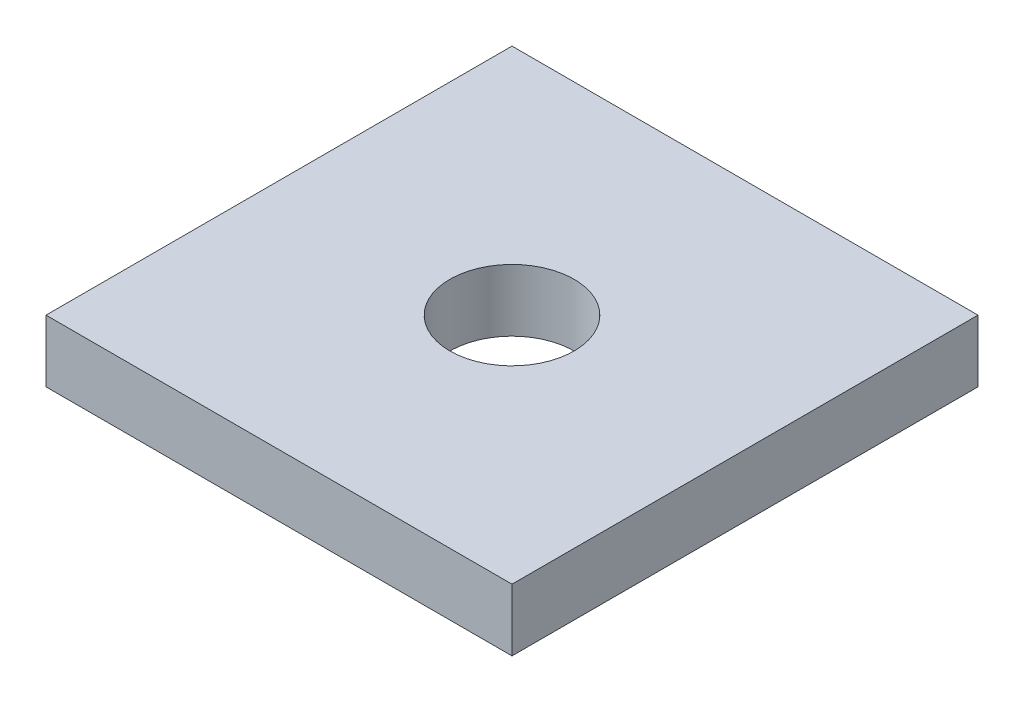
ISO-10303-21;
HEADER;
FILE_DESCRIPTION(('STEP AP214'),'2;1');
FILE_NAME('part.step','',(''),(''),'','','');
FILE_SCHEMA(('AUTOMOTIVE_DESIGN { 1 0 10303 214 1 1 1 1 }'));
ENDSEC;
DATA;
#1=APPLICATION_CONTEXT('core data for automotive mechanical design processes');
#2=APPLICATION_PROTOCOL_DEFINITION('international standard','automotive_design',2000,#1);
#3=PRODUCT_CONTEXT('',#1,'mechanical');
#4=PRODUCT('Part','Part','',(#3));
#5=PRODUCT_RELATED_PRODUCT_CATEGORY('part','',(#4));
#6=PRODUCT_DEFINITION_FORMATION('','',#4);
#7=PRODUCT_DEFINITION_CONTEXT('part definition',#1,'design');
#8=PRODUCT_DEFINITION('design','',#6,#7);
#9=PRODUCT_DEFINITION_SHAPE('','',#8);
#10=(LENGTH_UNIT() NAMED_UNIT(*) SI_UNIT(.MILLI.,.METRE.));
#11=(NAMED_UNIT(*) PLANE_ANGLE_UNIT() SI_UNIT($,.RADIAN.));
#12=(NAMED_UNIT(*) SI_UNIT($,.STERADIAN.) SOLID_ANGLE_UNIT());
#13=UNCERTAINTY_MEASURE_WITH_UNIT(LENGTH_MEASURE(1.E-05),#10,'distance_accuracy_value','');
#14=(GEOMETRIC_REPRESENTATION_CONTEXT(3) GLOBAL_UNCERTAINTY_ASSIGNED_CONTEXT((#13)) GLOBAL_UNIT_ASSIGNED_CONTEXT((#10,
#11,#12)) REPRESENTATION_CONTEXT('',''));
#15=CARTESIAN_POINT('',(0.,0.,0.));
#16=DIRECTION('',(0.,0.,1.));
#17=DIRECTION('',(1.,0.,0.));
#18=AXIS2_PLACEMENT_3D('',#15,#16,#17);
#19=CARTESIAN_POINT('',(19.05,5.08,19.05));
#20=DIRECTION('',(-1.,0.,0.));
#21=DIRECTION('',(0.,0.,1.));
#22=AXIS2_PLACEMENT_3D('',#19,#20,#21);
#23=PLANE('',#22);
#24=DIRECTION('',(0.,0.,-1.));
#25=VECTOR('',#24,1.);
#26=CARTESIAN_POINT('',(19.05,0.,19.05));
#27=LINE('',#26,#25);
#28=CARTESIAN_POINT('',(19.05,0.,19.05));
#29=VERTEX_POINT('',#28);
#30=CARTESIAN_POINT('',(19.05,0.,-19.05));
#31=VERTEX_POINT('',#30);
#32=EDGE_CURVE('E107',#29,#31,#27,.T.);
#33=ORIENTED_EDGE('',*,*,#32,.T.);
#34=DIRECTION('',(0.,-1.,0.));
#35=VECTOR('',#34,1.);
#36=CARTESIAN_POINT('',(19.05,5.08,-19.05));
#37=LINE('',#36,#35);
#38=CARTESIAN_POINT('',(19.05,5.08,-19.05));
#39=VERTEX_POINT('',#38);
#40=EDGE_CURVE('E11',#39,#31,#37,.T.);
#41=ORIENTED_EDGE('',*,*,#40,.F.);
#42=DIRECTION('',(0.,0.,-1.));
#43=VECTOR('',#42,1.);
#44=CARTESIAN_POINT('',(19.05,5.08,19.05));
#45=LINE('',#44,#43);
#46=CARTESIAN_POINT('',(19.05,5.08,19.05));
#47=VERTEX_POINT('',#46);
#48=EDGE_CURVE('E91',#47,#39,#45,.T.);
#49=ORIENTED_EDGE('',*,*,#48,.F.);
#50=DIRECTION('',(0.,-1.,0.));
#51=VECTOR('',#50,1.);
#52=CARTESIAN_POINT('',(19.05,5.08,19.05));
#53=LINE('',#52,#51);
#54=EDGE_CURVE('E103',#47,#29,#53,.T.);
#55=ORIENTED_EDGE('',*,*,#54,.T.);
#56=EDGE_LOOP('',(#33,#41,#49,#55));
#57=FACE_BOUND('',#56,.T.);
#58=ADVANCED_FACE('F39',(#57),#23,.F.);
#59=CARTESIAN_POINT('',(-19.05,5.08,-19.05));
#60=DIRECTION('',(0.,0.,1.));
#61=DIRECTION('',(1.,0.,0.));
#62=AXIS2_PLACEMENT_3D('',#59,#60,#61);
#63=PLANE('',#62);
#64=DIRECTION('',(-1.,0.,0.));
#65=VECTOR('',#64,1.);
#66=CARTESIAN_POINT('',(-19.05,0.,-19.05));
#67=LINE('',#66,#65);
#68=CARTESIAN_POINT('',(-19.05,0.,-19.05));
#69=VERTEX_POINT('',#68);
#70=EDGE_CURVE('E96',#31,#69,#67,.T.);
#71=ORIENTED_EDGE('',*,*,#70,.T.);
#72=DIRECTION('',(0.,-1.,0.));
#73=VECTOR('',#72,1.);
#74=CARTESIAN_POINT('',(-19.05,5.08,-19.05));
#75=LINE('',#74,#73);
#76=CARTESIAN_POINT('',(-19.05,5.08,-19.05));
#77=VERTEX_POINT('',#76);
#78=EDGE_CURVE('E48',#77,#69,#75,.T.);
#79=ORIENTED_EDGE('',*,*,#78,.F.);
#80=DIRECTION('',(-1.,0.,0.));
#81=VECTOR('',#80,1.);
#82=CARTESIAN_POINT('',(-19.05,5.08,-19.05));
#83=LINE('',#82,#81);
#84=EDGE_CURVE('E86',#39,#77,#83,.T.);
#85=ORIENTED_EDGE('',*,*,#84,.F.);
#86=ORIENTED_EDGE('',*,*,#40,.T.);
#87=EDGE_LOOP('',(#71,#79,#85,#86));
#88=FACE_BOUND('',#87,.T.);
#89=ADVANCED_FACE('F95',(#88),#63,.F.);
#90=CARTESIAN_POINT('',(-19.05,5.08,19.05));
#91=DIRECTION('',(1.,0.,0.));
#92=DIRECTION('',(0.,0.,-1.));
#93=AXIS2_PLACEMENT_3D('',#90,#91,#92);
#94=PLANE('',#93);
#95=DIRECTION('',(0.,0.,1.));
#96=VECTOR('',#95,1.);
#97=CARTESIAN_POINT('',(-19.05,0.,19.05));
#98=LINE('',#97,#96);
#99=CARTESIAN_POINT('',(-19.05,0.,19.05));
#100=VERTEX_POINT('',#99);
#101=EDGE_CURVE('E73',#69,#100,#98,.T.);
#102=ORIENTED_EDGE('',*,*,#101,.T.);
#103=DIRECTION('',(0.,-1.,0.));
#104=VECTOR('',#103,1.);
#105=CARTESIAN_POINT('',(-19.05,5.08,19.05));
#106=LINE('',#105,#104);
#107=CARTESIAN_POINT('',(-19.05,5.08,19.05));
#108=VERTEX_POINT('',#107);
#109=EDGE_CURVE('E98',#108,#100,#106,.T.);
#110=ORIENTED_EDGE('',*,*,#109,.F.);
#111=DIRECTION('',(0.,0.,1.));
#112=VECTOR('',#111,1.);
#113=CARTESIAN_POINT('',(-19.05,5.08,19.05));
#114=LINE('',#113,#112);
#115=EDGE_CURVE('E89',#77,#108,#114,.T.);
#116=ORIENTED_EDGE('',*,*,#115,.F.);
#117=ORIENTED_EDGE('',*,*,#78,.T.);
#118=EDGE_LOOP('',(#102,#110,#116,#117));
#119=FACE_BOUND('',#118,.T.);
#120=ADVANCED_FACE('F99',(#119),#94,.F.);
#121=CARTESIAN_POINT('',(-19.05,5.08,19.05));
#122=DIRECTION('',(0.,0.,-1.));
#123=DIRECTION('',(-1.,0.,0.));
#124=AXIS2_PLACEMENT_3D('',#121,#122,#123);
#125=PLANE('',#124);
#126=DIRECTION('',(1.,0.,0.));
#127=VECTOR('',#126,1.);
#128=CARTESIAN_POINT('',(-19.05,0.,19.05));
#129=LINE('',#128,#127);
#130=EDGE_CURVE('E79',#100,#29,#129,.T.);
#131=ORIENTED_EDGE('',*,*,#130,.T.);
#132=ORIENTED_EDGE('',*,*,#54,.F.);
#133=DIRECTION('',(1.,0.,0.));
#134=VECTOR('',#133,1.);
#135=CARTESIAN_POINT('',(-19.05,5.08,19.05));
#136=LINE('',#135,#134);
#137=EDGE_CURVE('E56',#108,#47,#136,.T.);
#138=ORIENTED_EDGE('',*,*,#137,.F.);
#139=ORIENTED_EDGE('',*,*,#109,.T.);
#140=EDGE_LOOP('',(#131,#132,#138,#139));
#141=FACE_BOUND('',#140,.T.);
#142=ADVANCED_FACE('F121',(#141),#125,.F.);
#143=CARTESIAN_POINT('',(0.,5.08,0.));
#144=DIRECTION('',(0.,-1.,0.));
#145=DIRECTION('',(0.,0.,-1.));
#146=AXIS2_PLACEMENT_3D('',#143,#144,#145);
#147=PLANE('',#146);
#148=CARTESIAN_POINT('',(0.,5.08,0.));
#149=DIRECTION('',(0.,1.,0.));
#150=DIRECTION('',(0.,0.,1.));
#151=AXIS2_PLACEMENT_3D('',#148,#149,#150);
#152=CIRCLE('',#151,5.08);
#153=CARTESIAN_POINT('',(0.,5.08,5.08));
#154=VERTEX_POINT('',#153);
#155=EDGE_CURVE('E128',#154,#154,#152,.T.);
#156=ORIENTED_EDGE('',*,*,#155,.F.);
#157=EDGE_LOOP('',(#156));
#158=FACE_BOUND('',#157,.T.);
#159=ORIENTED_EDGE('',*,*,#48,.T.);
#160=ORIENTED_EDGE('',*,*,#84,.T.);
#161=ORIENTED_EDGE('',*,*,#115,.T.);
#162=ORIENTED_EDGE('',*,*,#137,.T.);
#163=EDGE_LOOP('',(#159,#160,#161,#162));
#164=FACE_BOUND('',#163,.T.);
#165=ADVANCED_FACE('F87',(#158,#164),#147,.F.);
#166=CARTESIAN_POINT('',(0.,0.,0.));
#167=DIRECTION('',(0.,-1.,0.));
#168=DIRECTION('',(0.,0.,-1.));
#169=AXIS2_PLACEMENT_3D('',#166,#167,#168);
#170=PLANE('',#169);
#171=CARTESIAN_POINT('',(0.,0.,0.));
#172=DIRECTION('',(0.,1.,0.));
#173=DIRECTION('',(0.,0.,1.));
#174=AXIS2_PLACEMENT_3D('',#171,#172,#173);
#175=CIRCLE('',#174,5.08);
#176=CARTESIAN_POINT('',(0.,0.,5.08));
#177=VERTEX_POINT('',#176);
#178=EDGE_CURVE('E111',#177,#177,#175,.T.);
#179=ORIENTED_EDGE('',*,*,#178,.T.);
#180=EDGE_LOOP('',(#179));
#181=FACE_BOUND('',#180,.T.);
#182=ORIENTED_EDGE('',*,*,#32,.F.);
#183=ORIENTED_EDGE('',*,*,#130,.F.);
#184=ORIENTED_EDGE('',*,*,#101,.F.);
#185=ORIENTED_EDGE('',*,*,#70,.F.);
#186=EDGE_LOOP('',(#182,#183,#184,#185));
#187=FACE_BOUND('',#186,.T.);
#188=ADVANCED_FACE('F124',(#181,#187),#170,.T.);
#189=CARTESIAN_POINT('',(0.,0.,0.));
#190=DIRECTION('',(0.,1.,0.));
#191=DIRECTION('',(0.,0.,1.));
#192=AXIS2_PLACEMENT_3D('',#189,#190,#191);
#193=CYLINDRICAL_SURFACE('',#192,5.08);
#194=ORIENTED_EDGE('',*,*,#178,.F.);
#195=EDGE_LOOP('',(#194));
#196=FACE_BOUND('',#195,.T.);
#197=ORIENTED_EDGE('',*,*,#155,.T.);
#198=EDGE_LOOP('',(#197));
#199=FACE_BOUND('',#198,.T.);
#200=ADVANCED_FACE('F137',(#196,#199),#193,.F.);
#201=CLOSED_SHELL('',(#58,#89,#120,#142,#165,#188,#200));
#202=MANIFOLD_SOLID_BREP('B2',#201);
#203=ADVANCED_BREP_SHAPE_REPRESENTATION('',(#18,#202),#14);
#204=SHAPE_DEFINITION_REPRESENTATION(#9,#203);
ENDSEC;
END-ISO-10303-21;
